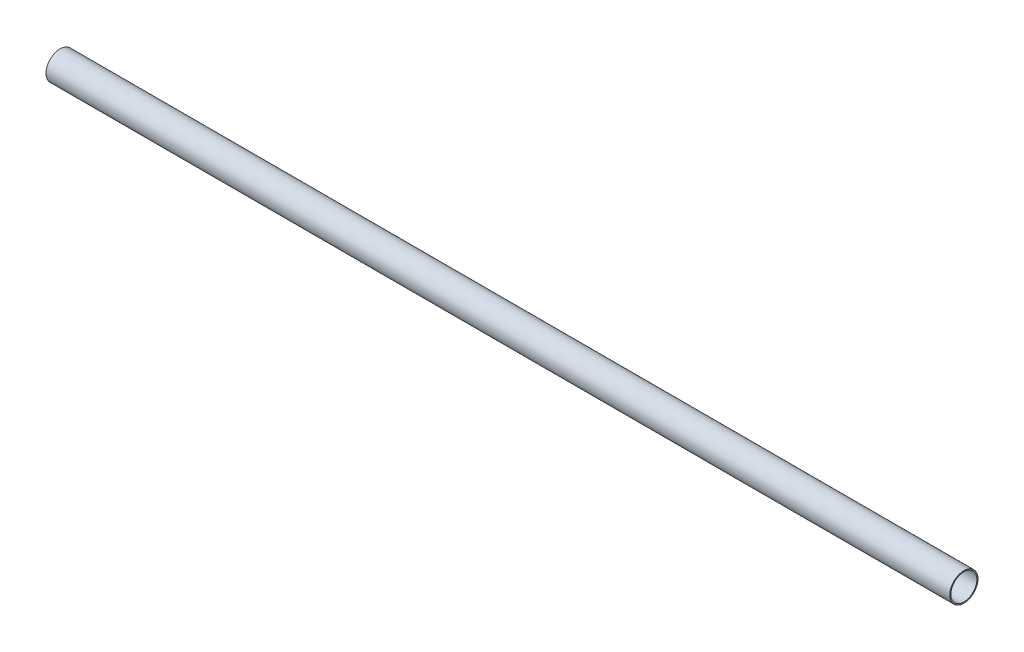
ISO-10303-21;
HEADER;
FILE_DESCRIPTION(('STEP AP214'),'2;1');
FILE_NAME('part.step','',(''),(''),'','','');
FILE_SCHEMA(('AUTOMOTIVE_DESIGN { 1 0 10303 214 1 1 1 1 }'));
ENDSEC;
DATA;
#1=APPLICATION_CONTEXT('core data for automotive mechanical design processes');
#2=APPLICATION_PROTOCOL_DEFINITION('international standard','automotive_design',2000,#1);
#3=PRODUCT_CONTEXT('',#1,'mechanical');
#4=PRODUCT('Part','Part','',(#3));
#5=PRODUCT_RELATED_PRODUCT_CATEGORY('part','',(#4));
#6=PRODUCT_DEFINITION_FORMATION('','',#4);
#7=PRODUCT_DEFINITION_CONTEXT('part definition',#1,'design');
#8=PRODUCT_DEFINITION('design','',#6,#7);
#9=PRODUCT_DEFINITION_SHAPE('','',#8);
#10=(LENGTH_UNIT() NAMED_UNIT(*) SI_UNIT(.MILLI.,.METRE.));
#11=(NAMED_UNIT(*) PLANE_ANGLE_UNIT() SI_UNIT($,.RADIAN.));
#12=(NAMED_UNIT(*) SI_UNIT($,.STERADIAN.) SOLID_ANGLE_UNIT());
#13=UNCERTAINTY_MEASURE_WITH_UNIT(LENGTH_MEASURE(1.E-05),#10,'distance_accuracy_value','');
#14=(GEOMETRIC_REPRESENTATION_CONTEXT(3) GLOBAL_UNCERTAINTY_ASSIGNED_CONTEXT((#13)) GLOBAL_UNIT_ASSIGNED_CONTEXT((#10,
#11,#12)) REPRESENTATION_CONTEXT('',''));
#15=CARTESIAN_POINT('',(0.,0.,0.));
#16=DIRECTION('',(0.,0.,1.));
#17=DIRECTION('',(1.,0.,0.));
#18=AXIS2_PLACEMENT_3D('',#15,#16,#17);
#19=CARTESIAN_POINT('',(457.2,0.,0.));
#20=DIRECTION('',(1.,0.,0.));
#21=DIRECTION('',(0.,0.,-1.));
#22=AXIS2_PLACEMENT_3D('',#19,#20,#21);
#23=PLANE('',#22);
#24=CARTESIAN_POINT('',(457.2,0.,0.));
#25=DIRECTION('',(1.,0.,0.));
#26=DIRECTION('',(0.,0.,-1.));
#27=AXIS2_PLACEMENT_3D('',#24,#25,#26);
#28=CIRCLE('',#27,6.35);
#29=CARTESIAN_POINT('',(457.2,0.,-6.35));
#30=VERTEX_POINT('',#29);
#31=EDGE_CURVE('E11',#30,#30,#28,.T.);
#32=ORIENTED_EDGE('',*,*,#31,.T.);
#33=EDGE_LOOP('',(#32));
#34=FACE_BOUND('',#33,.T.);
#35=CARTESIAN_POINT('',(457.2,0.,0.));
#36=DIRECTION('',(1.,0.,0.));
#37=DIRECTION('',(0.,0.,-1.));
#38=AXIS2_PLACEMENT_3D('',#35,#36,#37);
#39=CIRCLE('',#38,5.842);
#40=CARTESIAN_POINT('',(457.2,0.,-5.842));
#41=VERTEX_POINT('',#40);
#42=EDGE_CURVE('E47',#41,#41,#39,.T.);
#43=ORIENTED_EDGE('',*,*,#42,.F.);
#44=EDGE_LOOP('',(#43));
#45=FACE_BOUND('',#44,.T.);
#46=ADVANCED_FACE('F39',(#34,#45),#23,.T.);
#47=CARTESIAN_POINT('',(457.2,0.,0.));
#48=DIRECTION('',(-1.,0.,0.));
#49=DIRECTION('',(0.,0.,1.));
#50=AXIS2_PLACEMENT_3D('',#47,#48,#49);
#51=CYLINDRICAL_SURFACE('',#50,6.35);
#52=CARTESIAN_POINT('',(50.8,0.,0.));
#53=DIRECTION('',(1.,0.,0.));
#54=DIRECTION('',(0.,0.,-1.));
#55=AXIS2_PLACEMENT_3D('',#52,#53,#54);
#56=CIRCLE('',#55,6.35);
#57=CARTESIAN_POINT('',(50.8,0.,-6.35));
#58=VERTEX_POINT('',#57);
#59=EDGE_CURVE('E57',#58,#58,#56,.F.);
#60=ORIENTED_EDGE('',*,*,#59,.F.);
#61=EDGE_LOOP('',(#60));
#62=FACE_BOUND('',#61,.T.);
#63=ORIENTED_EDGE('',*,*,#31,.F.);
#64=EDGE_LOOP('',(#63));
#65=FACE_BOUND('',#64,.T.);
#66=ADVANCED_FACE('F41',(#62,#65),#51,.T.);
#67=CARTESIAN_POINT('',(457.2,0.,0.));
#68=DIRECTION('',(-1.,0.,0.));
#69=DIRECTION('',(0.,0.,1.));
#70=AXIS2_PLACEMENT_3D('',#67,#68,#69);
#71=CYLINDRICAL_SURFACE('',#70,5.842);
#72=CARTESIAN_POINT('',(50.8,0.,0.));
#73=DIRECTION('',(1.,0.,0.));
#74=DIRECTION('',(0.,0.,-1.));
#75=AXIS2_PLACEMENT_3D('',#72,#73,#74);
#76=CIRCLE('',#75,5.842);
#77=CARTESIAN_POINT('',(50.8,0.,-5.842));
#78=VERTEX_POINT('',#77);
#79=EDGE_CURVE('E52',#78,#78,#76,.F.);
#80=ORIENTED_EDGE('',*,*,#79,.T.);
#81=EDGE_LOOP('',(#80));
#82=FACE_BOUND('',#81,.T.);
#83=ORIENTED_EDGE('',*,*,#42,.T.);
#84=EDGE_LOOP('',(#83));
#85=FACE_BOUND('',#84,.T.);
#86=ADVANCED_FACE('F69',(#82,#85),#71,.F.);
#87=CARTESIAN_POINT('',(50.8,0.,0.));
#88=DIRECTION('',(1.,0.,0.));
#89=DIRECTION('',(0.,0.,-1.));
#90=AXIS2_PLACEMENT_3D('',#87,#88,#89);
#91=PLANE('',#90);
#92=ORIENTED_EDGE('',*,*,#59,.T.);
#93=EDGE_LOOP('',(#92));
#94=FACE_BOUND('',#93,.T.);
#95=ORIENTED_EDGE('',*,*,#79,.F.);
#96=EDGE_LOOP('',(#95));
#97=FACE_BOUND('',#96,.T.);
#98=ADVANCED_FACE('F64',(#94,#97),#91,.F.);
#99=CLOSED_SHELL('',(#46,#66,#86,#98));
#100=MANIFOLD_SOLID_BREP('B2',#99);
#101=ADVANCED_BREP_SHAPE_REPRESENTATION('',(#18,#100),#14);
#102=SHAPE_DEFINITION_REPRESENTATION(#9,#101);
ENDSEC;
END-ISO-10303-21;
